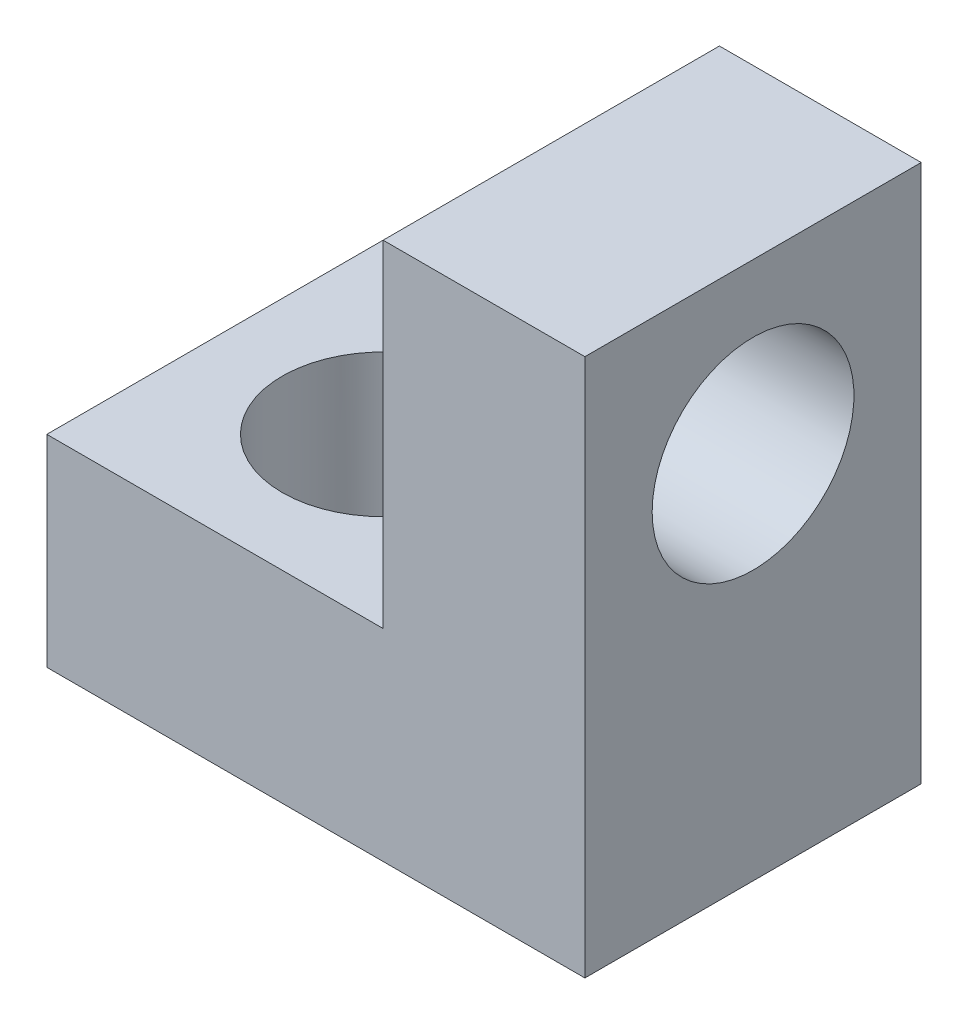
ISO-10303-21;
HEADER;
FILE_DESCRIPTION(('STEP AP214'),'2;1');
FILE_NAME('part.step','',(''),(''),'','','');
FILE_SCHEMA(('AUTOMOTIVE_DESIGN { 1 0 10303 214 1 1 1 1 }'));
ENDSEC;
DATA;
#1=APPLICATION_CONTEXT('core data for automotive mechanical design processes');
#2=APPLICATION_PROTOCOL_DEFINITION('international standard','automotive_design',2000,#1);
#3=PRODUCT_CONTEXT('',#1,'mechanical');
#4=PRODUCT('Part','Part','',(#3));
#5=PRODUCT_RELATED_PRODUCT_CATEGORY('part','',(#4));
#6=PRODUCT_DEFINITION_FORMATION('','',#4);
#7=PRODUCT_DEFINITION_CONTEXT('part definition',#1,'design');
#8=PRODUCT_DEFINITION('design','',#6,#7);
#9=PRODUCT_DEFINITION_SHAPE('','',#8);
#10=(LENGTH_UNIT() NAMED_UNIT(*) SI_UNIT(.MILLI.,.METRE.));
#11=(NAMED_UNIT(*) PLANE_ANGLE_UNIT() SI_UNIT($,.RADIAN.));
#12=(NAMED_UNIT(*) SI_UNIT($,.STERADIAN.) SOLID_ANGLE_UNIT());
#13=UNCERTAINTY_MEASURE_WITH_UNIT(LENGTH_MEASURE(1.E-05),#10,'distance_accuracy_value','');
#14=(GEOMETRIC_REPRESENTATION_CONTEXT(3) GLOBAL_UNCERTAINTY_ASSIGNED_CONTEXT((#13)) GLOBAL_UNIT_ASSIGNED_CONTEXT((#10,
#11,#12)) REPRESENTATION_CONTEXT('',''));
#15=CARTESIAN_POINT('',(0.,0.,0.));
#16=DIRECTION('',(0.,0.,1.));
#17=DIRECTION('',(1.,0.,0.));
#18=AXIS2_PLACEMENT_3D('',#15,#16,#17);
#19=CARTESIAN_POINT('',(0.,3.,0.));
#20=DIRECTION('',(0.,-1.,0.));
#21=DIRECTION('',(0.,0.,-1.));
#22=AXIS2_PLACEMENT_3D('',#19,#20,#21);
#23=PLANE('',#22);
#24=CARTESIAN_POINT('',(-1.5,3.,0.));
#25=DIRECTION('',(0.,1.,0.));
#26=DIRECTION('',(0.,0.,1.));
#27=AXIS2_PLACEMENT_3D('',#24,#25,#26);
#28=CIRCLE('',#27,1.5);
#29=CARTESIAN_POINT('',(-1.5,3.,1.5));
#30=VERTEX_POINT('',#29);
#31=EDGE_CURVE('E251',#30,#30,#28,.T.);
#32=ORIENTED_EDGE('',*,*,#31,.F.);
#33=EDGE_LOOP('',(#32));
#34=FACE_BOUND('',#33,.T.);
#35=DIRECTION('',(0.,0.,1.));
#36=VECTOR('',#35,1.);
#37=CARTESIAN_POINT('',(0.999999999999998,3.,-2.5));
#38=LINE('',#37,#36);
#39=CARTESIAN_POINT('',(0.999999999999999,3.,-2.5));
#40=VERTEX_POINT('',#39);
#41=CARTESIAN_POINT('',(0.999999999999999,3.,2.5));
#42=VERTEX_POINT('',#41);
#43=EDGE_CURVE('E52',#40,#42,#38,.T.);
#44=ORIENTED_EDGE('',*,*,#43,.F.);
#45=DIRECTION('',(-1.,0.,0.));
#46=VECTOR('',#45,1.);
#47=CARTESIAN_POINT('',(-4.,3.,-2.5));
#48=LINE('',#47,#46);
#49=CARTESIAN_POINT('',(-4.,3.,-2.5));
#50=VERTEX_POINT('',#49);
#51=EDGE_CURVE('E89',#40,#50,#48,.T.);
#52=ORIENTED_EDGE('',*,*,#51,.T.);
#53=DIRECTION('',(0.,0.,1.));
#54=VECTOR('',#53,1.);
#55=CARTESIAN_POINT('',(-4.,3.,2.5));
#56=LINE('',#55,#54);
#57=CARTESIAN_POINT('',(-4.,3.,2.5));
#58=VERTEX_POINT('',#57);
#59=EDGE_CURVE('E58',#50,#58,#56,.T.);
#60=ORIENTED_EDGE('',*,*,#59,.T.);
#61=DIRECTION('',(1.,0.,0.));
#62=VECTOR('',#61,1.);
#63=CARTESIAN_POINT('',(-4.,3.,2.5));
#64=LINE('',#63,#62);
#65=EDGE_CURVE('E99',#58,#42,#64,.T.);
#66=ORIENTED_EDGE('',*,*,#65,.T.);
#67=EDGE_LOOP('',(#44,#52,#60,#66));
#68=FACE_BOUND('',#67,.T.);
#69=ADVANCED_FACE('F36',(#34,#68),#23,.F.);
#70=CARTESIAN_POINT('',(4.,3.,2.5));
#71=DIRECTION('',(-1.,0.,0.));
#72=DIRECTION('',(0.,0.,1.));
#73=AXIS2_PLACEMENT_3D('',#70,#71,#72);
#74=PLANE('',#73);
#75=CARTESIAN_POINT('',(4.,5.5,0.));
#76=DIRECTION('',(-1.,0.,0.));
#77=DIRECTION('',(0.,0.,1.));
#78=AXIS2_PLACEMENT_3D('',#75,#76,#77);
#79=CIRCLE('',#78,1.5);
#80=CARTESIAN_POINT('',(4.,5.5,1.5));
#81=VERTEX_POINT('',#80);
#82=EDGE_CURVE('E250',#81,#81,#79,.T.);
#83=ORIENTED_EDGE('',*,*,#82,.T.);
#84=EDGE_LOOP('',(#83));
#85=FACE_BOUND('',#84,.T.);
#86=DIRECTION('',(0.,0.,-1.));
#87=VECTOR('',#86,1.);
#88=CARTESIAN_POINT('',(4.,0.,2.5));
#89=LINE('',#88,#87);
#90=CARTESIAN_POINT('',(4.,0.,2.5));
#91=VERTEX_POINT('',#90);
#92=CARTESIAN_POINT('',(4.,0.,-2.5));
#93=VERTEX_POINT('',#92);
#94=EDGE_CURVE('E96',#91,#93,#89,.T.);
#95=ORIENTED_EDGE('',*,*,#94,.T.);
#96=DIRECTION('',(0.,-1.,0.));
#97=VECTOR('',#96,1.);
#98=CARTESIAN_POINT('',(4.,3.,-2.5));
#99=LINE('',#98,#97);
#100=CARTESIAN_POINT('',(4.,8.,-2.5));
#101=VERTEX_POINT('',#100);
#102=EDGE_CURVE('E11',#101,#93,#99,.T.);
#103=ORIENTED_EDGE('',*,*,#102,.F.);
#104=DIRECTION('',(0.,0.,-1.));
#105=VECTOR('',#104,1.);
#106=CARTESIAN_POINT('',(4.,8.,-2.5));
#107=LINE('',#106,#105);
#108=CARTESIAN_POINT('',(4.,8.,2.5));
#109=VERTEX_POINT('',#108);
#110=EDGE_CURVE('E98',#109,#101,#107,.T.);
#111=ORIENTED_EDGE('',*,*,#110,.F.);
#112=DIRECTION('',(0.,-1.,0.));
#113=VECTOR('',#112,1.);
#114=CARTESIAN_POINT('',(4.,3.,2.5));
#115=LINE('',#114,#113);
#116=EDGE_CURVE('E82',#109,#91,#115,.T.);
#117=ORIENTED_EDGE('',*,*,#116,.T.);
#118=EDGE_LOOP('',(#95,#103,#111,#117));
#119=FACE_BOUND('',#118,.T.);
#120=ADVANCED_FACE('F38',(#85,#119),#74,.F.);
#121=CARTESIAN_POINT('',(-4.,3.,-2.5));
#122=DIRECTION('',(0.,0.,1.));
#123=DIRECTION('',(1.,0.,0.));
#124=AXIS2_PLACEMENT_3D('',#121,#122,#123);
#125=PLANE('',#124);
#126=DIRECTION('',(-1.,0.,0.));
#127=VECTOR('',#126,1.);
#128=CARTESIAN_POINT('',(-4.,0.,-2.5));
#129=LINE('',#128,#127);
#130=CARTESIAN_POINT('',(-4.,0.,-2.5));
#131=VERTEX_POINT('',#130);
#132=EDGE_CURVE('E102',#93,#131,#129,.T.);
#133=ORIENTED_EDGE('',*,*,#132,.T.);
#134=DIRECTION('',(0.,-1.,0.));
#135=VECTOR('',#134,1.);
#136=CARTESIAN_POINT('',(-4.,3.,-2.5));
#137=LINE('',#136,#135);
#138=EDGE_CURVE('E45',#50,#131,#137,.T.);
#139=ORIENTED_EDGE('',*,*,#138,.F.);
#140=ORIENTED_EDGE('',*,*,#51,.F.);
#141=DIRECTION('',(0.,-1.,0.));
#142=VECTOR('',#141,1.);
#143=CARTESIAN_POINT('',(0.999999999999998,8.,-2.5));
#144=LINE('',#143,#142);
#145=CARTESIAN_POINT('',(0.999999999999998,8.,-2.5));
#146=VERTEX_POINT('',#145);
#147=EDGE_CURVE('E103',#146,#40,#144,.T.);
#148=ORIENTED_EDGE('',*,*,#147,.F.);
#149=DIRECTION('',(-1.,0.,0.));
#150=VECTOR('',#149,1.);
#151=CARTESIAN_POINT('',(4.,8.,-2.5));
#152=LINE('',#151,#150);
#153=EDGE_CURVE('E124',#101,#146,#152,.T.);
#154=ORIENTED_EDGE('',*,*,#153,.F.);
#155=ORIENTED_EDGE('',*,*,#102,.T.);
#156=EDGE_LOOP('',(#133,#139,#140,#148,#154,#155));
#157=FACE_BOUND('',#156,.T.);
#158=ADVANCED_FACE('F119',(#157),#125,.F.);
#159=CARTESIAN_POINT('',(-4.,3.,2.5));
#160=DIRECTION('',(1.,0.,0.));
#161=DIRECTION('',(0.,0.,-1.));
#162=AXIS2_PLACEMENT_3D('',#159,#160,#161);
#163=PLANE('',#162);
#164=DIRECTION('',(0.,0.,1.));
#165=VECTOR('',#164,1.);
#166=CARTESIAN_POINT('',(-4.,0.,2.5));
#167=LINE('',#166,#165);
#168=CARTESIAN_POINT('',(-4.,0.,2.5));
#169=VERTEX_POINT('',#168);
#170=EDGE_CURVE('E90',#131,#169,#167,.T.);
#171=ORIENTED_EDGE('',*,*,#170,.T.);
#172=DIRECTION('',(0.,-1.,0.));
#173=VECTOR('',#172,1.);
#174=CARTESIAN_POINT('',(-4.,3.,2.5));
#175=LINE('',#174,#173);
#176=EDGE_CURVE('E85',#58,#169,#175,.T.);
#177=ORIENTED_EDGE('',*,*,#176,.F.);
#178=ORIENTED_EDGE('',*,*,#59,.F.);
#179=ORIENTED_EDGE('',*,*,#138,.T.);
#180=EDGE_LOOP('',(#171,#177,#178,#179));
#181=FACE_BOUND('',#180,.T.);
#182=ADVANCED_FACE('F117',(#181),#163,.F.);
#183=CARTESIAN_POINT('',(-4.,3.,2.5));
#184=DIRECTION('',(0.,0.,-1.));
#185=DIRECTION('',(-1.,0.,0.));
#186=AXIS2_PLACEMENT_3D('',#183,#184,#185);
#187=PLANE('',#186);
#188=DIRECTION('',(1.,0.,0.));
#189=VECTOR('',#188,1.);
#190=CARTESIAN_POINT('',(-4.,0.,2.5));
#191=LINE('',#190,#189);
#192=EDGE_CURVE('E78',#169,#91,#191,.T.);
#193=ORIENTED_EDGE('',*,*,#192,.T.);
#194=ORIENTED_EDGE('',*,*,#116,.F.);
#195=DIRECTION('',(1.,0.,0.));
#196=VECTOR('',#195,1.);
#197=CARTESIAN_POINT('',(4.,8.,2.5));
#198=LINE('',#197,#196);
#199=CARTESIAN_POINT('',(0.999999999999999,8.,2.5));
#200=VERTEX_POINT('',#199);
#201=EDGE_CURVE('E138',#200,#109,#198,.T.);
#202=ORIENTED_EDGE('',*,*,#201,.F.);
#203=DIRECTION('',(0.,-1.,0.));
#204=VECTOR('',#203,1.);
#205=CARTESIAN_POINT('',(0.999999999999999,8.,2.5));
#206=LINE('',#205,#204);
#207=EDGE_CURVE('E107',#200,#42,#206,.T.);
#208=ORIENTED_EDGE('',*,*,#207,.T.);
#209=ORIENTED_EDGE('',*,*,#65,.F.);
#210=ORIENTED_EDGE('',*,*,#176,.T.);
#211=EDGE_LOOP('',(#193,#194,#202,#208,#209,#210));
#212=FACE_BOUND('',#211,.T.);
#213=ADVANCED_FACE('F80',(#212),#187,.F.);
#214=CARTESIAN_POINT('',(0.,0.,0.));
#215=DIRECTION('',(0.,-1.,0.));
#216=DIRECTION('',(0.,0.,-1.));
#217=AXIS2_PLACEMENT_3D('',#214,#215,#216);
#218=PLANE('',#217);
#219=CARTESIAN_POINT('',(-1.5,0.,0.));
#220=DIRECTION('',(0.,-1.,0.));
#221=DIRECTION('',(0.,0.,-1.));
#222=AXIS2_PLACEMENT_3D('',#219,#220,#221);
#223=CIRCLE('',#222,1.5);
#224=CARTESIAN_POINT('',(-1.5,0.,-1.5));
#225=VERTEX_POINT('',#224);
#226=EDGE_CURVE('E40',#225,#225,#223,.T.);
#227=ORIENTED_EDGE('',*,*,#226,.F.);
#228=EDGE_LOOP('',(#227));
#229=FACE_BOUND('',#228,.T.);
#230=ORIENTED_EDGE('',*,*,#94,.F.);
#231=ORIENTED_EDGE('',*,*,#192,.F.);
#232=ORIENTED_EDGE('',*,*,#170,.F.);
#233=ORIENTED_EDGE('',*,*,#132,.F.);
#234=EDGE_LOOP('',(#230,#231,#232,#233));
#235=FACE_BOUND('',#234,.T.);
#236=ADVANCED_FACE('F101',(#229,#235),#218,.T.);
#237=CARTESIAN_POINT('',(0.999999999999998,8.,-2.5));
#238=DIRECTION('',(1.,0.,0.));
#239=DIRECTION('',(0.,0.,-1.));
#240=AXIS2_PLACEMENT_3D('',#237,#238,#239);
#241=PLANE('',#240);
#242=CARTESIAN_POINT('',(0.999999999999999,5.5,0.));
#243=DIRECTION('',(-1.,0.,0.));
#244=DIRECTION('',(0.,0.,1.));
#245=AXIS2_PLACEMENT_3D('',#242,#243,#244);
#246=CIRCLE('',#245,1.5);
#247=CARTESIAN_POINT('',(0.999999999999999,5.5,1.5));
#248=VERTEX_POINT('',#247);
#249=EDGE_CURVE('E247',#248,#248,#246,.T.);
#250=ORIENTED_EDGE('',*,*,#249,.F.);
#251=EDGE_LOOP('',(#250));
#252=FACE_BOUND('',#251,.T.);
#253=ORIENTED_EDGE('',*,*,#43,.T.);
#254=ORIENTED_EDGE('',*,*,#207,.F.);
#255=DIRECTION('',(0.,0.,1.));
#256=VECTOR('',#255,1.);
#257=CARTESIAN_POINT('',(0.999999999999998,8.,-2.5));
#258=LINE('',#257,#256);
#259=EDGE_CURVE('E135',#146,#200,#258,.T.);
#260=ORIENTED_EDGE('',*,*,#259,.F.);
#261=ORIENTED_EDGE('',*,*,#147,.T.);
#262=EDGE_LOOP('',(#253,#254,#260,#261));
#263=FACE_BOUND('',#262,.T.);
#264=ADVANCED_FACE('F142',(#252,#263),#241,.F.);
#265=CARTESIAN_POINT('',(0.,8.,0.));
#266=DIRECTION('',(0.,-1.,0.));
#267=DIRECTION('',(0.,0.,-1.));
#268=AXIS2_PLACEMENT_3D('',#265,#266,#267);
#269=PLANE('',#268);
#270=ORIENTED_EDGE('',*,*,#110,.T.);
#271=ORIENTED_EDGE('',*,*,#153,.T.);
#272=ORIENTED_EDGE('',*,*,#259,.T.);
#273=ORIENTED_EDGE('',*,*,#201,.T.);
#274=EDGE_LOOP('',(#270,#271,#272,#273));
#275=FACE_BOUND('',#274,.T.);
#276=ADVANCED_FACE('F137',(#275),#269,.F.);
#277=CARTESIAN_POINT('',(-1.5,-2.,0.));
#278=DIRECTION('',(0.,1.,0.));
#279=DIRECTION('',(0.,0.,1.));
#280=AXIS2_PLACEMENT_3D('',#277,#278,#279);
#281=CYLINDRICAL_SURFACE('',#280,1.5);
#282=ORIENTED_EDGE('',*,*,#226,.T.);
#283=EDGE_LOOP('',(#282));
#284=FACE_BOUND('',#283,.T.);
#285=ORIENTED_EDGE('',*,*,#31,.T.);
#286=EDGE_LOOP('',(#285));
#287=FACE_BOUND('',#286,.T.);
#288=ADVANCED_FACE('F196',(#284,#287),#281,.F.);
#289=CARTESIAN_POINT('',(6.,5.5,0.));
#290=DIRECTION('',(-1.,0.,0.));
#291=DIRECTION('',(0.,0.,1.));
#292=AXIS2_PLACEMENT_3D('',#289,#290,#291);
#293=CYLINDRICAL_SURFACE('',#292,1.5);
#294=ORIENTED_EDGE('',*,*,#249,.T.);
#295=EDGE_LOOP('',(#294));
#296=FACE_BOUND('',#295,.T.);
#297=ORIENTED_EDGE('',*,*,#82,.F.);
#298=EDGE_LOOP('',(#297));
#299=FACE_BOUND('',#298,.T.);
#300=ADVANCED_FACE('F201',(#296,#299),#293,.F.);
#301=CLOSED_SHELL('',(#69,#120,#158,#182,#213,#236,#264,#276,#288,#300));
#302=MANIFOLD_SOLID_BREP('B2',#301);
#303=ADVANCED_BREP_SHAPE_REPRESENTATION('',(#18,#302),#14);
#304=SHAPE_DEFINITION_REPRESENTATION(#9,#303);
ENDSEC;
END-ISO-10303-21;
